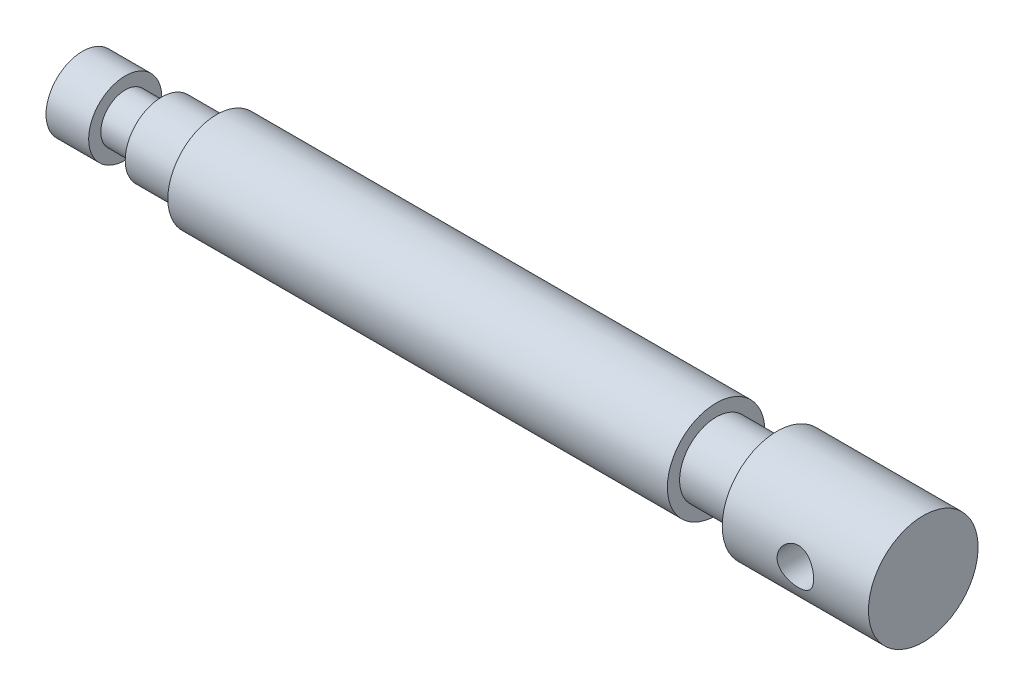
ISO-10303-21;
HEADER;
FILE_DESCRIPTION(('STEP AP214'),'2;1');
FILE_NAME('part.step','',(''),(''),'','','');
FILE_SCHEMA(('AUTOMOTIVE_DESIGN { 1 0 10303 214 1 1 1 1 }'));
ENDSEC;
DATA;
#1=APPLICATION_CONTEXT('core data for automotive mechanical design processes');
#2=APPLICATION_PROTOCOL_DEFINITION('international standard','automotive_design',2000,#1);
#3=PRODUCT_CONTEXT('',#1,'mechanical');
#4=PRODUCT('Part','Part','',(#3));
#5=PRODUCT_RELATED_PRODUCT_CATEGORY('part','',(#4));
#6=PRODUCT_DEFINITION_FORMATION('','',#4);
#7=PRODUCT_DEFINITION_CONTEXT('part definition',#1,'design');
#8=PRODUCT_DEFINITION('design','',#6,#7);
#9=PRODUCT_DEFINITION_SHAPE('','',#8);
#10=(LENGTH_UNIT() NAMED_UNIT(*) SI_UNIT(.MILLI.,.METRE.));
#11=(NAMED_UNIT(*) PLANE_ANGLE_UNIT() SI_UNIT($,.RADIAN.));
#12=(NAMED_UNIT(*) SI_UNIT($,.STERADIAN.) SOLID_ANGLE_UNIT());
#13=UNCERTAINTY_MEASURE_WITH_UNIT(LENGTH_MEASURE(1.E-05),#10,'distance_accuracy_value','');
#14=(GEOMETRIC_REPRESENTATION_CONTEXT(3) GLOBAL_UNCERTAINTY_ASSIGNED_CONTEXT((#13)) GLOBAL_UNIT_ASSIGNED_CONTEXT((#10,
#11,#12)) REPRESENTATION_CONTEXT('',''));
#15=CARTESIAN_POINT('',(0.,0.,0.));
#16=DIRECTION('',(0.,0.,1.));
#17=DIRECTION('',(1.,0.,0.));
#18=AXIS2_PLACEMENT_3D('',#15,#16,#17);
#19=CARTESIAN_POINT('',(-134.848431632911,0.,0.));
#20=DIRECTION('',(-1.,0.,0.));
#21=DIRECTION('',(0.,0.,1.));
#22=AXIS2_PLACEMENT_3D('',#19,#20,#21);
#23=PLANE('',#22);
#24=CARTESIAN_POINT('',(-134.848431632911,0.,0.));
#25=DIRECTION('',(-1.,0.,0.));
#26=DIRECTION('',(0.,0.,1.));
#27=AXIS2_PLACEMENT_3D('',#24,#25,#26);
#28=CIRCLE('',#27,6.);
#29=CARTESIAN_POINT('',(-134.848431632911,0.,6.));
#30=VERTEX_POINT('',#29);
#31=EDGE_CURVE('E125',#30,#30,#28,.T.);
#32=ORIENTED_EDGE('',*,*,#31,.T.);
#33=EDGE_LOOP('',(#32));
#34=FACE_BOUND('',#33,.T.);
#35=ADVANCED_FACE('F39',(#34),#23,.T.);
#36=CARTESIAN_POINT('',(3.15156836708785,5.13478148889135E-13,0.));
#37=DIRECTION('',(1.,0.,0.));
#38=DIRECTION('',(0.,0.,-1.));
#39=AXIS2_PLACEMENT_3D('',#36,#37,#38);
#40=PLANE('',#39);
#41=CARTESIAN_POINT('',(3.15156836708785,5.13478148889135E-13,0.));
#42=DIRECTION('',(-1.,0.,0.));
#43=DIRECTION('',(0.,0.,1.));
#44=AXIS2_PLACEMENT_3D('',#41,#42,#43);
#45=CIRCLE('',#44,9.);
#46=CARTESIAN_POINT('',(3.15156836708785,5.13478148889135E-13,9.));
#47=VERTEX_POINT('',#46);
#48=EDGE_CURVE('E10',#47,#47,#45,.T.);
#49=ORIENTED_EDGE('',*,*,#48,.F.);
#50=EDGE_LOOP('',(#49));
#51=FACE_BOUND('',#50,.T.);
#52=ADVANCED_FACE('F114',(#51),#40,.T.);
#53=CARTESIAN_POINT('',(-164.248525738924,0.,1.2490009027033E-13));
#54=DIRECTION('',(-1.,0.,0.));
#55=DIRECTION('',(0.,0.,1.));
#56=AXIS2_PLACEMENT_3D('',#53,#54,#55);
#57=CYLINDRICAL_SURFACE('',#56,9.);
#58=CARTESIAN_POINT('',(-5.8484316329121,0.,9.00000000000001));
#59=CARTESIAN_POINT('',(-5.84843087171718,0.163690088660147,9.00000045902833));
#60=CARTESIAN_POINT('',(-5.86187243129401,0.327375583615604,8.99549308522647));
#61=CARTESIAN_POINT('',(-5.91511895936404,0.649925282618892,8.97795630609855));
#62=CARTESIAN_POINT('',(-5.95492666475891,0.808788984356473,8.96492601606458));
#63=CARTESIAN_POINT('',(-6.05938936306426,1.11699836850531,8.93175923719329));
#64=CARTESIAN_POINT('',(-6.12400282029014,1.266359477658,8.91163463192574));
#65=CARTESIAN_POINT('',(-6.27605515142737,1.55212481041588,8.86633337152039));
#66=CARTESIAN_POINT('',(-6.36349852791993,1.68852647087612,8.84115572003334));
#67=CARTESIAN_POINT('',(-6.56190904748833,1.9492250250668,8.78742283329015));
#68=CARTESIAN_POINT('',(-6.67352533569372,2.07301110089481,8.7587866939137));
#69=CARTESIAN_POINT('',(-6.91573309703197,2.30049807810614,8.7018094434938));
#70=CARTESIAN_POINT('',(-7.04632873769767,2.40419455646839,8.67346839871647));
#71=CARTESIAN_POINT('',(-7.32738697850148,2.59147482668362,8.6193999743182));
#72=CARTESIAN_POINT('',(-7.47831285210858,2.67439457466305,8.59377117827078));
#73=CARTESIAN_POINT('',(-7.79295991628798,2.81345662163312,8.54925916255818));
#74=CARTESIAN_POINT('',(-7.95667718440058,2.86960709216033,8.53037388482238));
#75=CARTESIAN_POINT('',(-8.2864512974025,2.95162038452747,8.50233909808132));
#76=CARTESIAN_POINT('',(-8.45224325837957,2.97844034481517,8.49288287308847));
#77=CARTESIAN_POINT('',(-8.78622289538005,3.00402337000357,8.48386969888535));
#78=CARTESIAN_POINT('',(-8.95440981503999,3.0027951048147,8.4843096906819));
#79=CARTESIAN_POINT('',(-9.28024152424438,2.97305971111073,8.4947704502454));
#80=CARTESIAN_POINT('',(-9.43801684166927,2.94580173950102,8.5043524760261));
#81=CARTESIAN_POINT('',(-9.74661189173275,2.86681848854829,8.53129973173664));
#82=CARTESIAN_POINT('',(-9.89743078921761,2.81509027977608,8.54866589352324));
#83=CARTESIAN_POINT('',(-10.1906698816868,2.68781717418118,8.58953733393745));
#84=CARTESIAN_POINT('',(-10.3329157093207,2.61190214612197,8.61313697379359));
#85=CARTESIAN_POINT('',(-10.6030443577513,2.43866731890955,8.66377675727188));
#86=CARTESIAN_POINT('',(-10.7309230137125,2.34134133709246,8.69081789371393));
#87=CARTESIAN_POINT('',(-10.9757064273947,2.12204799804728,8.74701987503223));
#88=CARTESIAN_POINT('',(-11.0916897164393,1.99905945022928,8.77621768064534));
#89=CARTESIAN_POINT('',(-11.3016254329023,1.73501870991049,8.83220815161116));
#90=CARTESIAN_POINT('',(-11.3955757474058,1.59396478698291,8.85900058614203));
#91=CARTESIAN_POINT('',(-11.5595205336176,1.29584283913936,8.90751323813383));
#92=CARTESIAN_POINT('',(-11.6292681069344,1.13862982924949,8.92918050024126));
#93=CARTESIAN_POINT('',(-11.7410411547793,0.813807250093971,8.96461701433311));
#94=CARTESIAN_POINT('',(-11.7830762591826,0.646201314465348,8.97838900964636));
#95=CARTESIAN_POINT('',(-11.8365986309795,0.313151488588422,8.99602881214323));
#96=CARTESIAN_POINT('',(-11.8493310604307,0.147928799595034,9.00030005501198));
#97=CARTESIAN_POINT('',(-11.847433612117,-0.18232520988021,8.99966708084494));
#98=CARTESIAN_POINT('',(-11.8328083529727,-0.347356557958429,8.99476441258085));
#99=CARTESIAN_POINT('',(-11.7775959097045,-0.66755959891229,8.97660074151315));
#100=CARTESIAN_POINT('',(-11.7377730147641,-0.822878420504118,8.96358596133595));
#101=CARTESIAN_POINT('',(-11.6342512995123,-1.12456787573827,8.93075540490227));
#102=CARTESIAN_POINT('',(-11.570549434509,-1.27093736552527,8.91093876140026));
#103=CARTESIAN_POINT('',(-11.41922033739,-1.55486488917937,8.8658679386187));
#104=CARTESIAN_POINT('',(-11.3310078530631,-1.69208987765119,8.84048444267376));
#105=CARTESIAN_POINT('',(-11.1338491828721,-1.95019449040645,8.78715761748806));
#106=CARTESIAN_POINT('',(-11.0248966648171,-2.07106910338616,8.75921350781484));
#107=CARTESIAN_POINT('',(-10.7834953798925,-2.29875752341855,8.7023054394133));
#108=CARTESIAN_POINT('',(-10.6502039521318,-2.40468290773747,8.67335283262292));
#109=CARTESIAN_POINT('',(-10.3671169294794,-2.59277256697078,8.61899919884137));
#110=CARTESIAN_POINT('',(-10.2173211970093,-2.67493664379248,8.59359820146009));
#111=CARTESIAN_POINT('',(-9.90541258704159,-2.81279079124858,8.54947175374151));
#112=CARTESIAN_POINT('',(-9.74332539540519,-2.86853439649525,8.53073282378943));
#113=CARTESIAN_POINT('',(-9.41129568277916,-2.95168400027831,8.50232496919353));
#114=CARTESIAN_POINT('',(-9.24135673669835,-2.97910276486144,8.49265195870915));
#115=CARTESIAN_POINT('',(-8.90784034478855,-3.00382884743141,8.48393576622535));
#116=CARTESIAN_POINT('',(-8.74438461205087,-3.00261077192493,8.48437200772262));
#117=CARTESIAN_POINT('',(-8.42013640814516,-2.97372688034616,8.49453809471617));
#118=CARTESIAN_POINT('',(-8.25934377904604,-2.94606263837585,8.50426738708083));
#119=CARTESIAN_POINT('',(-7.94802464390409,-2.86611543938796,8.53153572914676));
#120=CARTESIAN_POINT('',(-7.79736115789824,-2.81431003804631,8.54892294067452));
#121=CARTESIAN_POINT('',(-7.50674941209717,-2.68793809727901,8.58949196455426));
#122=CARTESIAN_POINT('',(-7.36680353934798,-2.61336650566134,8.61267506290182));
#123=CARTESIAN_POINT('',(-7.09498062314339,-2.43978207775028,8.66348487678138));
#124=CARTESIAN_POINT('',(-6.96372212721709,-2.33984472829362,8.69126134926426));
#125=CARTESIAN_POINT('',(-6.71936219275964,-2.11992864940682,8.74750068849775));
#126=CARTESIAN_POINT('',(-6.60626590584789,-1.99994425335442,8.77596374737119));
#127=CARTESIAN_POINT('',(-6.39699839604463,-1.73772467076207,8.83170091576632));
#128=CARTESIAN_POINT('',(-6.30165858965935,-1.5948045404991,8.85888545403784));
#129=CARTESIAN_POINT('',(-6.13646034636037,-1.29407207221978,8.9077797351785));
#130=CARTESIAN_POINT('',(-6.06659539514595,-1.13626355439704,8.9294908772379));
#131=CARTESIAN_POINT('',(-5.95726673544611,-0.817480941602946,8.96416545205626));
#132=CARTESIAN_POINT('',(-5.91658423412225,-0.656963273029198,8.97747637267581));
#133=CARTESIAN_POINT('',(-5.86217079088099,-0.330961248030692,8.99539221192678));
#134=CARTESIAN_POINT('',(-5.84843240242249,-0.165478276706215,8.99999953595715));
#135=CARTESIAN_POINT('',(-5.8484316329121,0.,9.00000000000001));
#136=B_SPLINE_CURVE_WITH_KNOTS('',3,(#58,#59,#60,#61,#62,#63,#64,#65,#66,#67,#68,#69,#70,#71,
#72,#73,#74,#75,#76,#77,#78,#79,#80,#81,#82,#83,#84,#85,#86,#87,#88,#89,#90,#91,#92,#93,#94,#95,
#96,#97,#98,#99,#100,#101,#102,#103,#104,#105,#106,#107,#108,#109,#110,#111,#112,#113,#114,#115,
#116,#117,#118,#119,#120,#121,#122,#123,#124,#125,#126,#127,#128,#129,#130,#131,#132,#133,#134,
#135),.UNSPECIFIED.,.T.,.F.,(4,2,2,2,2,2,2,2,2,2,2,2,2,2,2,2,2,2,2,2,2,2,2,2,2,2,2,2,2,2,2,2,2,
2,2,2,2,2,4),(0.,0.490461318078017,0.980973555802531,1.47066801861076,1.96045913339722,
2.4655405284826,2.97073299862581,3.49045154470411,4.01001134078513,4.51205777225535,
5.01394901962468,5.49290479653846,5.97191792566449,6.45864513465392,6.94551307674617,
7.45779917434094,7.97013437899846,8.48755216951062,9.00479006631613,9.49960749525499,
9.9943413949252,10.4747447393463,10.955209358523,11.4483119953121,11.9415654246567,
12.457230686423,12.9729002470508,13.4875204148041,14.0019085411763,14.4898699819288,
14.9778023805423,15.4564676124132,15.9352391452796,16.4349020007544,16.9347063337136,
17.4539898250532,17.9731404345739,18.4690967512146,18.9649159811444),.UNSPECIFIED.);
#137=CARTESIAN_POINT('',(-5.8484316329121,0.,9.00000000000001));
#138=VERTEX_POINT('',#137);
#139=EDGE_CURVE('E42',#138,#138,#136,.T.);
#140=ORIENTED_EDGE('',*,*,#139,.F.);
#141=EDGE_LOOP('',(#140));
#142=FACE_BOUND('',#141,.T.);
#143=CARTESIAN_POINT('',(-5.8484316329121,5.13478148889135E-13,-9.00000000000001));
#144=CARTESIAN_POINT('',(-5.84843087171712,-0.163690088659628,-9.00000045902835));
#145=CARTESIAN_POINT('',(-5.8618724312939,-0.327375583615099,-8.99549308522626));
#146=CARTESIAN_POINT('',(-5.91511895936398,-0.649925282618376,-8.97795630609832));
#147=CARTESIAN_POINT('',(-5.95492666475896,-0.808788984355931,-8.96492601606455));
#148=CARTESIAN_POINT('',(-6.05938936306421,-1.11699836850483,-8.93175923719329));
#149=CARTESIAN_POINT('',(-6.1240028202899,-1.26635947765761,-8.91163463192556));
#150=CARTESIAN_POINT('',(-6.27605515142718,-1.55212481041545,-8.86633337152021));
#151=CARTESIAN_POINT('',(-6.36349852791999,-1.68852647087556,-8.84115572003334));
#152=CARTESIAN_POINT('',(-6.56190904748837,-1.94922502506633,-8.78742283329016));
#153=CARTESIAN_POINT('',(-6.67352533569347,-2.07301110089458,-8.75878669391351));
#154=CARTESIAN_POINT('',(-6.91573309703169,-2.30049807810587,-8.70180944349361));
#155=CARTESIAN_POINT('',(-7.04632873769765,-2.40419455646784,-8.67346839871647));
#156=CARTESIAN_POINT('',(-7.32738697850139,-2.59147482668305,-8.61939997431822));
#157=CARTESIAN_POINT('',(-7.47831285210813,-2.67439457466277,-8.59377117827062));
#158=CARTESIAN_POINT('',(-7.79295991628713,-2.81345662163283,-8.54925916255802));
#159=CARTESIAN_POINT('',(-7.95667718439968,-2.86960709215974,-8.5303738848224));
#160=CARTESIAN_POINT('',(-8.2864512974015,-2.95162038452704,-8.50233909808129));
#161=CARTESIAN_POINT('',(-8.45224325837853,-2.97844034481513,-8.49288287308823));
#162=CARTESIAN_POINT('',(-8.78622289537895,-3.00402337000345,-8.48386969888515));
#163=CARTESIAN_POINT('',(-8.95440981503888,-3.00279510481409,-8.48430969068194));
#164=CARTESIAN_POINT('',(-9.28024152424343,-2.97305971111033,-8.49477045024537));
#165=CARTESIAN_POINT('',(-9.43801684166848,-2.94580173950126,-8.50435247602577));
#166=CARTESIAN_POINT('',(-9.74661189173189,-2.86681848854848,-8.53129973173633));
#167=CARTESIAN_POINT('',(-9.8974307892165,-2.8150902797756,-8.54866589352323));
#168=CARTESIAN_POINT('',(-10.190669881686,-2.6878171741806,-8.58953733393748));
#169=CARTESIAN_POINT('',(-10.3329157093204,-2.61190214612198,-8.61313697379334));
#170=CARTESIAN_POINT('',(-10.6030443577514,-2.43866731890968,-8.66377675727159));
#171=CARTESIAN_POINT('',(-10.7309230137124,-2.34134133709214,-8.69081789371387));
#172=CARTESIAN_POINT('',(-10.9757064273947,-2.12204799804669,-8.74701987503224));
#173=CARTESIAN_POINT('',(-11.0916897164396,-1.99905945022893,-8.77621768064516));
#174=CARTESIAN_POINT('',(-11.3016254329026,-1.7350187099102,-8.83220815161097));
#175=CARTESIAN_POINT('',(-11.3955757474059,-1.59396478698245,-8.85900058614201));
#176=CARTESIAN_POINT('',(-11.5595205336176,-1.2958428391388,-8.90751323813381));
#177=CARTESIAN_POINT('',(-11.6292681069346,-1.13862982924899,-8.92918050024105));
#178=CARTESIAN_POINT('',(-11.7410411547795,-0.813807250093506,-8.96461701433292));
#179=CARTESIAN_POINT('',(-11.7830762591827,-0.646201314464857,-8.97838900964638));
#180=CARTESIAN_POINT('',(-11.8365986309795,-0.313151488587919,-8.99602881214321));
#181=CARTESIAN_POINT('',(-11.8493310604306,-0.147928799594545,-9.00030005501172));
#182=CARTESIAN_POINT('',(-11.847433612117,0.182325209880709,-8.9996670808447));
#183=CARTESIAN_POINT('',(-11.8328083529727,0.347356557958951,-8.99476441258087));
#184=CARTESIAN_POINT('',(-11.7775959097045,0.667559598912762,-8.97660074151313));
#185=CARTESIAN_POINT('',(-11.7377730147639,0.822878420504519,-8.96358596133565));
#186=CARTESIAN_POINT('',(-11.6342512995122,1.12456787573871,-8.93075540490197));
#187=CARTESIAN_POINT('',(-11.570549434509,1.27093736552582,-8.91093876140025));
#188=CARTESIAN_POINT('',(-11.41922033739,1.55486488917982,-8.8658679386187));
#189=CARTESIAN_POINT('',(-11.3310078530629,1.69208987765143,-8.84048444267346));
#190=CARTESIAN_POINT('',(-11.1338491828719,1.95019449040675,-8.78715761748775));
#191=CARTESIAN_POINT('',(-11.0248966648171,2.07106910338673,-8.75921350781482));
#192=CARTESIAN_POINT('',(-10.7834953798926,2.29875752341891,-8.70230543941334));
#193=CARTESIAN_POINT('',(-10.6502039521318,2.40468290773732,-8.67335283262271));
#194=CARTESIAN_POINT('',(-10.3671169294797,2.59277256697073,-8.61899919884113));
#195=CARTESIAN_POINT('',(-10.2173211970101,2.67493664379304,-8.59359820146007));
#196=CARTESIAN_POINT('',(-9.90541258704267,2.81279079124908,-8.54947175374151));
#197=CARTESIAN_POINT('',(-9.74332539540608,2.86853439649505,-8.53073282378924));
#198=CARTESIAN_POINT('',(-9.41129568277999,2.95168400027808,-8.50232496919337));
#199=CARTESIAN_POINT('',(-9.24135673669931,2.97910276486186,-8.49265195870919));
#200=CARTESIAN_POINT('',(-8.90784034478963,3.00382884743198,-8.48393576622531));
#201=CARTESIAN_POINT('',(-8.74438461205194,3.00261077192505,-8.48437200772233));
#202=CARTESIAN_POINT('',(-8.42013640814618,2.97372688034622,-8.4945380947159));
#203=CARTESIAN_POINT('',(-8.25934377904704,2.94606263837629,-8.50426738708086));
#204=CARTESIAN_POINT('',(-7.94802464390495,2.8661154393885,-8.53153572914675));
#205=CARTESIAN_POINT('',(-7.79736115789901,2.81431003804656,-8.5489229406742));
#206=CARTESIAN_POINT('',(-7.50674941209756,2.68793809727927,-8.58949196455392));
#207=CARTESIAN_POINT('',(-7.36680353934808,2.61336650566192,-8.61267506290179));
#208=CARTESIAN_POINT('',(-7.09498062314341,2.43978207775085,-8.66348487678138));
#209=CARTESIAN_POINT('',(-6.96372212721732,2.33984472829386,-8.69126134926397));
#210=CARTESIAN_POINT('',(-6.71936219275987,2.119928649407,-8.74750068849744));
#211=CARTESIAN_POINT('',(-6.60626590584791,1.99994425335488,-8.77596374737117));
#212=CARTESIAN_POINT('',(-6.39699839604461,1.73772467076263,-8.83170091576632));
#213=CARTESIAN_POINT('',(-6.30165858965953,1.59480454049948,-8.85888545403753));
#214=CARTESIAN_POINT('',(-6.13646034636057,1.2940720722201,-8.90777973517819));
#215=CARTESIAN_POINT('',(-6.06659539514599,1.13626355439749,-8.92949087723789));
#216=CARTESIAN_POINT('',(-5.95726673544608,0.817480941603484,-8.96416545205625));
#217=CARTESIAN_POINT('',(-5.91658423412231,0.656963273029686,-8.97747637267553));
#218=CARTESIAN_POINT('',(-5.86217079088109,0.330961248031162,-8.9953922119265));
#219=CARTESIAN_POINT('',(-5.84843240242254,0.165478276706716,-8.99999953595714));
#220=CARTESIAN_POINT('',(-5.8484316329121,5.13478148889135E-13,-9.00000000000001));
#221=B_SPLINE_CURVE_WITH_KNOTS('',3,(#143,#144,#145,#146,#147,#148,#149,#150,#151,#152,#153,
#154,#155,#156,#157,#158,#159,#160,#161,#162,#163,#164,#165,#166,#167,#168,#169,#170,#171,#172,
#173,#174,#175,#176,#177,#178,#179,#180,#181,#182,#183,#184,#185,#186,#187,#188,#189,#190,#191,
#192,#193,#194,#195,#196,#197,#198,#199,#200,#201,#202,#203,#204,#205,#206,#207,#208,#209,#210,
#211,#212,#213,#214,#215,#216,#217,#218,#219,#220),.UNSPECIFIED.,.T.,.F.,(4,2,2,2,2,2,2,2,2,2,2,
2,2,2,2,2,2,2,2,2,2,2,2,2,2,2,2,2,2,2,2,2,2,2,2,2,2,2,4),(0.,0.490461318078019,
0.980973555802535,1.4706680186108,1.96045913339728,2.46554052848267,2.9707329986259,
3.49045154470377,4.01001134078434,4.5120577722546,5.01394901962397,5.49290479653781,
5.97191792566392,6.45864513465385,6.94551307674657,7.45779917434134,7.97013437899891,
8.4875521695111,9.0047900663166,9.49960749525544,9.99434139492565,10.4747447393468,
10.9552093585235,11.4483119953124,11.9415654246571,12.4572306864229,12.9729002470503,
13.4875204148035,14.0019085411756,14.4898699819281,14.9778023805415,15.4564676124129,
15.9352391452798,16.4349020007545,16.9347063337137,17.4539898250533,17.973140434574,
18.4690967512146,18.9649159811444),.UNSPECIFIED.);
#222=CARTESIAN_POINT('',(-5.8484316329121,5.13478148889135E-13,-9.00000000000001));
#223=VERTEX_POINT('',#222);
#224=EDGE_CURVE('E59',#223,#223,#221,.T.);
#225=ORIENTED_EDGE('',*,*,#224,.F.);
#226=EDGE_LOOP('',(#225));
#227=FACE_BOUND('',#226,.T.);
#228=ORIENTED_EDGE('',*,*,#48,.T.);
#229=EDGE_LOOP('',(#228));
#230=FACE_BOUND('',#229,.T.);
#231=CARTESIAN_POINT('',(-20.8484316329124,5.13478148889135E-13,-3.88578058618805E-13));
#232=DIRECTION('',(-1.,0.,0.));
#233=DIRECTION('',(0.,0.,1.));
#234=AXIS2_PLACEMENT_3D('',#231,#232,#233);
#235=CIRCLE('',#234,9.);
#236=CARTESIAN_POINT('',(-20.8484316329124,5.13478148889135E-13,8.99999999999961));
#237=VERTEX_POINT('',#236);
#238=EDGE_CURVE('E51',#237,#237,#235,.T.);
#239=ORIENTED_EDGE('',*,*,#238,.F.);
#240=EDGE_LOOP('',(#239));
#241=FACE_BOUND('',#240,.T.);
#242=ADVANCED_FACE('F64',(#142,#227,#230,#241),#57,.T.);
#243=CARTESIAN_POINT('',(-20.8484316329124,5.13478148889135E-13,-3.88578058618805E-13));
#244=DIRECTION('',(-1.,0.,0.));
#245=DIRECTION('',(0.,0.,1.));
#246=AXIS2_PLACEMENT_3D('',#243,#244,#245);
#247=PLANE('',#246);
#248=ORIENTED_EDGE('',*,*,#238,.T.);
#249=EDGE_LOOP('',(#248));
#250=FACE_BOUND('',#249,.T.);
#251=CARTESIAN_POINT('',(-20.8484316329124,5.13478148889135E-13,-3.88578058618805E-13));
#252=DIRECTION('',(-1.,0.,0.));
#253=DIRECTION('',(0.,0.,1.));
#254=AXIS2_PLACEMENT_3D('',#251,#252,#253);
#255=CIRCLE('',#254,6.);
#256=CARTESIAN_POINT('',(-20.8484316329124,5.13478148889135E-13,5.99999999999961));
#257=VERTEX_POINT('',#256);
#258=EDGE_CURVE('E56',#257,#257,#255,.T.);
#259=ORIENTED_EDGE('',*,*,#258,.F.);
#260=EDGE_LOOP('',(#259));
#261=FACE_BOUND('',#260,.T.);
#262=ADVANCED_FACE('F107',(#250,#261),#247,.T.);
#263=CARTESIAN_POINT('',(-164.248525738924,0.,1.2490009027033E-13));
#264=DIRECTION('',(-1.,0.,0.));
#265=DIRECTION('',(0.,0.,1.));
#266=AXIS2_PLACEMENT_3D('',#263,#264,#265);
#267=CYLINDRICAL_SURFACE('',#266,6.);
#268=ORIENTED_EDGE('',*,*,#258,.T.);
#269=EDGE_LOOP('',(#268));
#270=FACE_BOUND('',#269,.T.);
#271=CARTESIAN_POINT('',(-30.8484316329124,0.,1.2490009027033E-13));
#272=DIRECTION('',(-1.,0.,0.));
#273=DIRECTION('',(0.,0.,1.));
#274=AXIS2_PLACEMENT_3D('',#271,#272,#273);
#275=CIRCLE('',#274,6.);
#276=CARTESIAN_POINT('',(-30.8484316329124,0.,6.00000000000013));
#277=VERTEX_POINT('',#276);
#278=EDGE_CURVE('E151',#277,#277,#275,.T.);
#279=ORIENTED_EDGE('',*,*,#278,.F.);
#280=EDGE_LOOP('',(#279));
#281=FACE_BOUND('',#280,.T.);
#282=ADVANCED_FACE('F104',(#270,#281),#267,.T.);
#283=CARTESIAN_POINT('',(-30.8484316329124,0.,1.2490009027033E-13));
#284=DIRECTION('',(1.,0.,0.));
#285=DIRECTION('',(0.,0.,-1.));
#286=AXIS2_PLACEMENT_3D('',#283,#284,#285);
#287=PLANE('',#286);
#288=ORIENTED_EDGE('',*,*,#278,.T.);
#289=EDGE_LOOP('',(#288));
#290=FACE_BOUND('',#289,.T.);
#291=CARTESIAN_POINT('',(-30.8484316329124,0.,1.2490009027033E-13));
#292=DIRECTION('',(-1.,0.,0.));
#293=DIRECTION('',(0.,0.,1.));
#294=AXIS2_PLACEMENT_3D('',#291,#292,#293);
#295=CIRCLE('',#294,8.);
#296=CARTESIAN_POINT('',(-30.8484316329124,0.,8.00000000000012));
#297=VERTEX_POINT('',#296);
#298=EDGE_CURVE('E148',#297,#297,#295,.T.);
#299=ORIENTED_EDGE('',*,*,#298,.F.);
#300=EDGE_LOOP('',(#299));
#301=FACE_BOUND('',#300,.T.);
#302=ADVANCED_FACE('F100',(#290,#301),#287,.T.);
#303=CARTESIAN_POINT('',(-164.248525738924,0.,1.2490009027033E-13));
#304=DIRECTION('',(-1.,0.,0.));
#305=DIRECTION('',(0.,0.,1.));
#306=AXIS2_PLACEMENT_3D('',#303,#304,#305);
#307=CYLINDRICAL_SURFACE('',#306,8.);
#308=ORIENTED_EDGE('',*,*,#298,.T.);
#309=EDGE_LOOP('',(#308));
#310=FACE_BOUND('',#309,.T.);
#311=CARTESIAN_POINT('',(-112.848431632912,5.13478148889135E-13,0.));
#312=DIRECTION('',(-1.,0.,0.));
#313=DIRECTION('',(0.,0.,1.));
#314=AXIS2_PLACEMENT_3D('',#311,#312,#313);
#315=CIRCLE('',#314,8.);
#316=CARTESIAN_POINT('',(-112.848431632912,5.13478148889135E-13,8.));
#317=VERTEX_POINT('',#316);
#318=EDGE_CURVE('E145',#317,#317,#315,.T.);
#319=ORIENTED_EDGE('',*,*,#318,.F.);
#320=EDGE_LOOP('',(#319));
#321=FACE_BOUND('',#320,.T.);
#322=ADVANCED_FACE('F96',(#310,#321),#307,.T.);
#323=CARTESIAN_POINT('',(-112.848431632912,5.13478148889135E-13,0.));
#324=DIRECTION('',(-1.,0.,0.));
#325=DIRECTION('',(0.,0.,1.));
#326=AXIS2_PLACEMENT_3D('',#323,#324,#325);
#327=PLANE('',#326);
#328=ORIENTED_EDGE('',*,*,#318,.T.);
#329=EDGE_LOOP('',(#328));
#330=FACE_BOUND('',#329,.T.);
#331=CARTESIAN_POINT('',(-112.848431632912,5.13478148889135E-13,0.));
#332=DIRECTION('',(-1.,0.,0.));
#333=DIRECTION('',(0.,0.,1.));
#334=AXIS2_PLACEMENT_3D('',#331,#332,#333);
#335=CIRCLE('',#334,6.);
#336=CARTESIAN_POINT('',(-112.848431632912,5.13478148889135E-13,6.));
#337=VERTEX_POINT('',#336);
#338=EDGE_CURVE('E142',#337,#337,#335,.T.);
#339=ORIENTED_EDGE('',*,*,#338,.F.);
#340=EDGE_LOOP('',(#339));
#341=FACE_BOUND('',#340,.T.);
#342=ADVANCED_FACE('F92',(#330,#341),#327,.T.);
#343=CARTESIAN_POINT('',(-164.248525738924,0.,1.2490009027033E-13));
#344=DIRECTION('',(-1.,0.,0.));
#345=DIRECTION('',(0.,0.,1.));
#346=AXIS2_PLACEMENT_3D('',#343,#344,#345);
#347=CYLINDRICAL_SURFACE('',#346,6.);
#348=ORIENTED_EDGE('',*,*,#338,.T.);
#349=EDGE_LOOP('',(#348));
#350=FACE_BOUND('',#349,.T.);
#351=CARTESIAN_POINT('',(-121.848431632912,0.,0.));
#352=DIRECTION('',(-1.,0.,0.));
#353=DIRECTION('',(0.,0.,1.));
#354=AXIS2_PLACEMENT_3D('',#351,#352,#353);
#355=CIRCLE('',#354,6.);
#356=CARTESIAN_POINT('',(-121.848431632912,0.,6.));
#357=VERTEX_POINT('',#356);
#358=EDGE_CURVE('E139',#357,#357,#355,.T.);
#359=ORIENTED_EDGE('',*,*,#358,.F.);
#360=EDGE_LOOP('',(#359));
#361=FACE_BOUND('',#360,.T.);
#362=ADVANCED_FACE('F88',(#350,#361),#347,.T.);
#363=CARTESIAN_POINT('',(-121.848431632912,0.,0.));
#364=DIRECTION('',(-1.,0.,0.));
#365=DIRECTION('',(0.,0.,1.));
#366=AXIS2_PLACEMENT_3D('',#363,#364,#365);
#367=PLANE('',#366);
#368=ORIENTED_EDGE('',*,*,#358,.T.);
#369=EDGE_LOOP('',(#368));
#370=FACE_BOUND('',#369,.T.);
#371=CARTESIAN_POINT('',(-121.848431632912,0.,0.));
#372=DIRECTION('',(-1.,0.,0.));
#373=DIRECTION('',(0.,0.,1.));
#374=AXIS2_PLACEMENT_3D('',#371,#372,#373);
#375=CIRCLE('',#374,4.);
#376=CARTESIAN_POINT('',(-121.848431632912,0.,4.));
#377=VERTEX_POINT('',#376);
#378=EDGE_CURVE('E136',#377,#377,#375,.T.);
#379=ORIENTED_EDGE('',*,*,#378,.F.);
#380=EDGE_LOOP('',(#379));
#381=FACE_BOUND('',#380,.T.);
#382=ADVANCED_FACE('F84',(#370,#381),#367,.T.);
#383=CARTESIAN_POINT('',(-164.248525738924,0.,1.2490009027033E-13));
#384=DIRECTION('',(-1.,0.,0.));
#385=DIRECTION('',(0.,0.,1.));
#386=AXIS2_PLACEMENT_3D('',#383,#384,#385);
#387=CYLINDRICAL_SURFACE('',#386,4.);
#388=ORIENTED_EDGE('',*,*,#378,.T.);
#389=EDGE_LOOP('',(#388));
#390=FACE_BOUND('',#389,.T.);
#391=CARTESIAN_POINT('',(-127.848431632912,5.13478148889135E-13,0.));
#392=DIRECTION('',(-1.,0.,0.));
#393=DIRECTION('',(0.,0.,1.));
#394=AXIS2_PLACEMENT_3D('',#391,#392,#393);
#395=CIRCLE('',#394,4.);
#396=CARTESIAN_POINT('',(-127.848431632912,5.13478148889135E-13,4.));
#397=VERTEX_POINT('',#396);
#398=EDGE_CURVE('E130',#397,#397,#395,.T.);
#399=ORIENTED_EDGE('',*,*,#398,.F.);
#400=EDGE_LOOP('',(#399));
#401=FACE_BOUND('',#400,.T.);
#402=ADVANCED_FACE('F80',(#390,#401),#387,.T.);
#403=CARTESIAN_POINT('',(-127.848431632912,5.13478148889135E-13,0.));
#404=DIRECTION('',(1.,0.,0.));
#405=DIRECTION('',(0.,0.,-1.));
#406=AXIS2_PLACEMENT_3D('',#403,#404,#405);
#407=PLANE('',#406);
#408=ORIENTED_EDGE('',*,*,#398,.T.);
#409=EDGE_LOOP('',(#408));
#410=FACE_BOUND('',#409,.T.);
#411=CARTESIAN_POINT('',(-127.848431632912,5.13478148889135E-13,0.));
#412=DIRECTION('',(-1.,0.,0.));
#413=DIRECTION('',(0.,0.,1.));
#414=AXIS2_PLACEMENT_3D('',#411,#412,#413);
#415=CIRCLE('',#414,6.);
#416=CARTESIAN_POINT('',(-127.848431632912,5.13478148889135E-13,6.));
#417=VERTEX_POINT('',#416);
#418=EDGE_CURVE('E127',#417,#417,#415,.T.);
#419=ORIENTED_EDGE('',*,*,#418,.F.);
#420=EDGE_LOOP('',(#419));
#421=FACE_BOUND('',#420,.T.);
#422=ADVANCED_FACE('F76',(#410,#421),#407,.T.);
#423=CARTESIAN_POINT('',(-164.248525738924,0.,1.2490009027033E-13));
#424=DIRECTION('',(-1.,0.,0.));
#425=DIRECTION('',(0.,0.,1.));
#426=AXIS2_PLACEMENT_3D('',#423,#424,#425);
#427=CYLINDRICAL_SURFACE('',#426,6.);
#428=ORIENTED_EDGE('',*,*,#418,.T.);
#429=EDGE_LOOP('',(#428));
#430=FACE_BOUND('',#429,.T.);
#431=ORIENTED_EDGE('',*,*,#31,.F.);
#432=EDGE_LOOP('',(#431));
#433=FACE_BOUND('',#432,.T.);
#434=ADVANCED_FACE('F71',(#430,#433),#427,.T.);
#435=CARTESIAN_POINT('',(-8.84843163291238,0.,-20.));
#436=DIRECTION('',(0.,0.,1.));
#437=DIRECTION('',(1.,0.,0.));
#438=AXIS2_PLACEMENT_3D('',#435,#436,#437);
#439=CYLINDRICAL_SURFACE('',#438,3.);
#440=ORIENTED_EDGE('',*,*,#139,.T.);
#441=EDGE_LOOP('',(#440));
#442=FACE_BOUND('',#441,.T.);
#443=ORIENTED_EDGE('',*,*,#224,.T.);
#444=EDGE_LOOP('',(#443));
#445=FACE_BOUND('',#444,.T.);
#446=ADVANCED_FACE('F67',(#442,#445),#439,.F.);
#447=CLOSED_SHELL('',(#35,#52,#242,#262,#282,#302,#322,#342,#362,#382,#402,#422,#434,#446));
#448=MANIFOLD_SOLID_BREP('B2',#447);
#449=ADVANCED_BREP_SHAPE_REPRESENTATION('',(#18,#448),#14);
#450=SHAPE_DEFINITION_REPRESENTATION(#9,#449);
ENDSEC;
END-ISO-10303-21;
